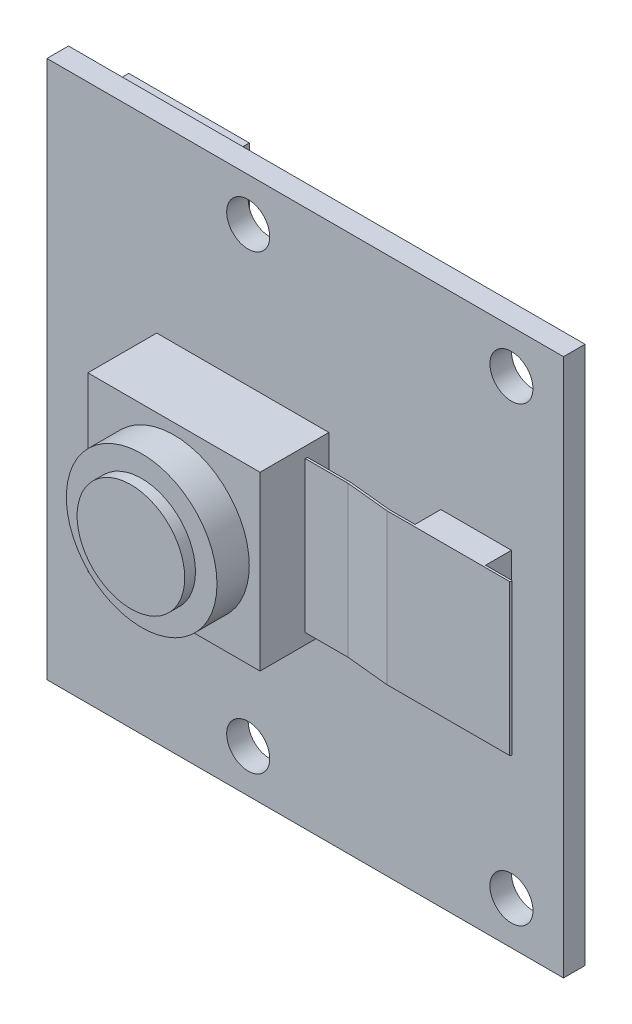
ISO-10303-21;
HEADER;
FILE_DESCRIPTION(('STEP AP214'),'2;1');
FILE_NAME('part.step','',(''),(''),'','','');
FILE_SCHEMA(('AUTOMOTIVE_DESIGN { 1 0 10303 214 1 1 1 1 }'));
ENDSEC;
DATA;
#1=APPLICATION_CONTEXT('core data for automotive mechanical design processes');
#2=APPLICATION_PROTOCOL_DEFINITION('international standard','automotive_design',2000,#1);
#3=PRODUCT_CONTEXT('',#1,'mechanical');
#4=PRODUCT('Part','Part','',(#3));
#5=PRODUCT_RELATED_PRODUCT_CATEGORY('part','',(#4));
#6=PRODUCT_DEFINITION_FORMATION('','',#4);
#7=PRODUCT_DEFINITION_CONTEXT('part definition',#1,'design');
#8=PRODUCT_DEFINITION('design','',#6,#7);
#9=PRODUCT_DEFINITION_SHAPE('','',#8);
#10=(LENGTH_UNIT() NAMED_UNIT(*) SI_UNIT(.MILLI.,.METRE.));
#11=(NAMED_UNIT(*) PLANE_ANGLE_UNIT() SI_UNIT($,.RADIAN.));
#12=(NAMED_UNIT(*) SI_UNIT($,.STERADIAN.) SOLID_ANGLE_UNIT());
#13=UNCERTAINTY_MEASURE_WITH_UNIT(LENGTH_MEASURE(1.E-05),#10,'distance_accuracy_value','');
#14=(GEOMETRIC_REPRESENTATION_CONTEXT(3) GLOBAL_UNCERTAINTY_ASSIGNED_CONTEXT((#13)) GLOBAL_UNIT_ASSIGNED_CONTEXT((#10,
#11,#12)) REPRESENTATION_CONTEXT('',''));
#15=CARTESIAN_POINT('',(0.,0.,0.));
#16=DIRECTION('',(0.,0.,1.));
#17=DIRECTION('',(1.,0.,0.));
#18=AXIS2_PLACEMENT_3D('',#15,#16,#17);
#19=CARTESIAN_POINT('',(0.,0.,0.));
#20=DIRECTION('',(0.,0.,1.));
#21=DIRECTION('',(1.,0.,0.));
#22=AXIS2_PLACEMENT_3D('',#19,#20,#21);
#23=PLANE('',#22);
#24=CARTESIAN_POINT('',(-2.65000000000001,10.5,0.));
#25=DIRECTION('',(0.,0.,1.));
#26=DIRECTION('',(-1.,0.,0.));
#27=AXIS2_PLACEMENT_3D('',#24,#25,#26);
#28=CIRCLE('',#27,1.);
#29=CARTESIAN_POINT('',(-3.65000000000001,10.5,0.));
#30=VERTEX_POINT('',#29);
#31=EDGE_CURVE('E410',#30,#30,#28,.T.);
#32=ORIENTED_EDGE('',*,*,#31,.T.);
#33=EDGE_LOOP('',(#32));
#34=FACE_BOUND('',#33,.T.);
#35=CARTESIAN_POINT('',(9.57999999999999,10.5,0.));
#36=DIRECTION('',(0.,0.,1.));
#37=DIRECTION('',(-1.,0.,0.));
#38=AXIS2_PLACEMENT_3D('',#35,#36,#37);
#39=CIRCLE('',#38,1.);
#40=CARTESIAN_POINT('',(8.57999999999999,10.5,0.));
#41=VERTEX_POINT('',#40);
#42=EDGE_CURVE('E415',#41,#41,#39,.T.);
#43=ORIENTED_EDGE('',*,*,#42,.T.);
#44=EDGE_LOOP('',(#43));
#45=FACE_BOUND('',#44,.T.);
#46=CARTESIAN_POINT('',(-2.65,-10.5,0.));
#47=DIRECTION('',(0.,0.,1.));
#48=DIRECTION('',(1.,0.,0.));
#49=AXIS2_PLACEMENT_3D('',#46,#47,#48);
#50=CIRCLE('',#49,1.);
#51=CARTESIAN_POINT('',(-1.65,-10.5,0.));
#52=VERTEX_POINT('',#51);
#53=EDGE_CURVE('E423',#52,#52,#50,.T.);
#54=ORIENTED_EDGE('',*,*,#53,.T.);
#55=EDGE_LOOP('',(#54));
#56=FACE_BOUND('',#55,.T.);
#57=CARTESIAN_POINT('',(9.57999999999999,-10.5,0.));
#58=DIRECTION('',(0.,0.,1.));
#59=DIRECTION('',(1.,0.,0.));
#60=AXIS2_PLACEMENT_3D('',#57,#58,#59);
#61=CIRCLE('',#60,1.);
#62=CARTESIAN_POINT('',(10.58,-10.5,0.));
#63=VERTEX_POINT('',#62);
#64=EDGE_CURVE('E431',#63,#63,#61,.T.);
#65=ORIENTED_EDGE('',*,*,#64,.T.);
#66=EDGE_LOOP('',(#65));
#67=FACE_BOUND('',#66,.T.);
#68=DIRECTION('',(1.,0.,0.));
#69=VECTOR('',#68,1.);
#70=CARTESIAN_POINT('',(-12.,9.99999999999999,0.));
#71=LINE('',#70,#69);
#72=CARTESIAN_POINT('',(-12.,9.99999999999998,0.));
#73=VERTEX_POINT('',#72);
#74=CARTESIAN_POINT('',(-6.40000000000001,9.99999999999998,0.));
#75=VERTEX_POINT('',#74);
#76=EDGE_CURVE('E222',#73,#75,#71,.T.);
#77=ORIENTED_EDGE('',*,*,#76,.F.);
#78=DIRECTION('',(0.,-1.,0.));
#79=VECTOR('',#78,1.);
#80=CARTESIAN_POINT('',(-12.,-12.5,0.));
#81=LINE('',#80,#79);
#82=CARTESIAN_POINT('',(-12.,12.5,0.));
#83=VERTEX_POINT('',#82);
#84=EDGE_CURVE('E458',#83,#73,#81,.T.);
#85=ORIENTED_EDGE('',*,*,#84,.F.);
#86=DIRECTION('',(-1.,0.,0.));
#87=VECTOR('',#86,1.);
#88=CARTESIAN_POINT('',(12.,12.5,0.));
#89=LINE('',#88,#87);
#90=CARTESIAN_POINT('',(12.,12.5,0.));
#91=VERTEX_POINT('',#90);
#92=EDGE_CURVE('E448',#91,#83,#89,.T.);
#93=ORIENTED_EDGE('',*,*,#92,.F.);
#94=DIRECTION('',(0.,1.,0.));
#95=VECTOR('',#94,1.);
#96=CARTESIAN_POINT('',(12.,-12.5,0.));
#97=LINE('',#96,#95);
#98=CARTESIAN_POINT('',(12.,-12.5,0.));
#99=VERTEX_POINT('',#98);
#100=EDGE_CURVE('E465',#99,#91,#97,.T.);
#101=ORIENTED_EDGE('',*,*,#100,.F.);
#102=DIRECTION('',(1.,0.,0.));
#103=VECTOR('',#102,1.);
#104=CARTESIAN_POINT('',(12.,-12.5,0.));
#105=LINE('',#104,#103);
#106=CARTESIAN_POINT('',(-12.,-12.5,0.));
#107=VERTEX_POINT('',#106);
#108=EDGE_CURVE('E462',#107,#99,#105,.T.);
#109=ORIENTED_EDGE('',*,*,#108,.F.);
#110=CARTESIAN_POINT('',(-12.,-10.,0.));
#111=VERTEX_POINT('',#110);
#112=EDGE_CURVE('E439',#111,#107,#81,.T.);
#113=ORIENTED_EDGE('',*,*,#112,.F.);
#114=DIRECTION('',(-1.,0.,0.));
#115=VECTOR('',#114,1.);
#116=CARTESIAN_POINT('',(-12.,-10.,0.));
#117=LINE('',#116,#115);
#118=CARTESIAN_POINT('',(-6.4,-10.,0.));
#119=VERTEX_POINT('',#118);
#120=EDGE_CURVE('E62',#119,#111,#117,.T.);
#121=ORIENTED_EDGE('',*,*,#120,.F.);
#122=DIRECTION('',(0.,-1.,0.));
#123=VECTOR('',#122,1.);
#124=CARTESIAN_POINT('',(-6.4,-10.,0.));
#125=LINE('',#124,#123);
#126=EDGE_CURVE('E57',#75,#119,#125,.T.);
#127=ORIENTED_EDGE('',*,*,#126,.F.);
#128=EDGE_LOOP('',(#77,#85,#93,#101,#109,#113,#121,#127));
#129=FACE_BOUND('',#128,.T.);
#130=ADVANCED_FACE('F41',(#34,#45,#56,#67,#129),#23,.F.);
#131=CARTESIAN_POINT('',(1.1,-4.,6.2));
#132=DIRECTION('',(-1.,0.,0.));
#133=DIRECTION('',(0.,0.,1.));
#134=AXIS2_PLACEMENT_3D('',#131,#132,#133);
#135=PLANE('',#134);
#136=DIRECTION('',(0.,1.,0.));
#137=VECTOR('',#136,1.);
#138=CARTESIAN_POINT('',(1.1,0.,4.2));
#139=LINE('',#138,#137);
#140=CARTESIAN_POINT('',(1.1,-4.,4.2));
#141=VERTEX_POINT('',#140);
#142=CARTESIAN_POINT('',(1.1,4.,4.2));
#143=VERTEX_POINT('',#142);
#144=EDGE_CURVE('E379',#141,#143,#139,.T.);
#145=ORIENTED_EDGE('',*,*,#144,.F.);
#146=DIRECTION('',(0.,0.,-1.));
#147=VECTOR('',#146,1.);
#148=CARTESIAN_POINT('',(1.1,-4.,6.2));
#149=LINE('',#148,#147);
#150=CARTESIAN_POINT('',(1.1,-4.,1.));
#151=VERTEX_POINT('',#150);
#152=EDGE_CURVE('E404',#141,#151,#149,.T.);
#153=ORIENTED_EDGE('',*,*,#152,.T.);
#154=DIRECTION('',(0.,1.,0.));
#155=VECTOR('',#154,1.);
#156=CARTESIAN_POINT('',(1.1,-4.,1.));
#157=LINE('',#156,#155);
#158=CARTESIAN_POINT('',(1.1,4.,1.));
#159=VERTEX_POINT('',#158);
#160=EDGE_CURVE('E390',#151,#159,#157,.T.);
#161=ORIENTED_EDGE('',*,*,#160,.T.);
#162=DIRECTION('',(0.,0.,-1.));
#163=VECTOR('',#162,1.);
#164=CARTESIAN_POINT('',(1.1,4.,6.2));
#165=LINE('',#164,#163);
#166=EDGE_CURVE('E401',#143,#159,#165,.T.);
#167=ORIENTED_EDGE('',*,*,#166,.F.);
#168=EDGE_LOOP('',(#145,#153,#161,#167));
#169=FACE_BOUND('',#168,.T.);
#170=DIRECTION('',(0.,0.,-1.));
#171=VECTOR('',#170,1.);
#172=CARTESIAN_POINT('',(1.1,-3.5,0.));
#173=LINE('',#172,#171);
#174=CARTESIAN_POINT('',(1.1,-3.5,2.1));
#175=VERTEX_POINT('',#174);
#176=CARTESIAN_POINT('',(1.1,-3.5,2.));
#177=VERTEX_POINT('',#176);
#178=EDGE_CURVE('E294',#175,#177,#173,.T.);
#179=ORIENTED_EDGE('',*,*,#178,.F.);
#180=DIRECTION('',(0.,1.,0.));
#181=VECTOR('',#180,1.);
#182=CARTESIAN_POINT('',(1.1,-3.5,2.1));
#183=LINE('',#182,#181);
#184=CARTESIAN_POINT('',(1.1,3.5,2.1));
#185=VERTEX_POINT('',#184);
#186=EDGE_CURVE('E336',#175,#185,#183,.T.);
#187=ORIENTED_EDGE('',*,*,#186,.T.);
#188=DIRECTION('',(0.,0.,-1.));
#189=VECTOR('',#188,1.);
#190=CARTESIAN_POINT('',(1.1,3.5,0.));
#191=LINE('',#190,#189);
#192=CARTESIAN_POINT('',(1.1,3.5,2.));
#193=VERTEX_POINT('',#192);
#194=EDGE_CURVE('E253',#185,#193,#191,.T.);
#195=ORIENTED_EDGE('',*,*,#194,.T.);
#196=DIRECTION('',(0.,1.,0.));
#197=VECTOR('',#196,1.);
#198=CARTESIAN_POINT('',(1.1,-3.5,2.));
#199=LINE('',#198,#197);
#200=EDGE_CURVE('E340',#177,#193,#199,.T.);
#201=ORIENTED_EDGE('',*,*,#200,.F.);
#202=EDGE_LOOP('',(#179,#187,#195,#201));
#203=FACE_BOUND('',#202,.T.);
#204=ADVANCED_FACE('F509',(#169,#203),#135,.F.);
#205=CARTESIAN_POINT('',(0.,0.,1.));
#206=DIRECTION('',(0.,0.,1.));
#207=DIRECTION('',(1.,0.,0.));
#208=AXIS2_PLACEMENT_3D('',#205,#206,#207);
#209=PLANE('',#208);
#210=CARTESIAN_POINT('',(9.57999999999999,10.5,1.));
#211=DIRECTION('',(0.,0.,1.));
#212=DIRECTION('',(-1.,0.,0.));
#213=AXIS2_PLACEMENT_3D('',#210,#211,#212);
#214=CIRCLE('',#213,1.);
#215=CARTESIAN_POINT('',(8.57999999999999,10.5,1.));
#216=VERTEX_POINT('',#215);
#217=EDGE_CURVE('E419',#216,#216,#214,.T.);
#218=ORIENTED_EDGE('',*,*,#217,.F.);
#219=EDGE_LOOP('',(#218));
#220=FACE_BOUND('',#219,.T.);
#221=CARTESIAN_POINT('',(9.57999999999999,-10.5,1.));
#222=DIRECTION('',(0.,0.,1.));
#223=DIRECTION('',(1.,0.,0.));
#224=AXIS2_PLACEMENT_3D('',#221,#222,#223);
#225=CIRCLE('',#224,1.);
#226=CARTESIAN_POINT('',(10.58,-10.5,1.));
#227=VERTEX_POINT('',#226);
#228=EDGE_CURVE('E435',#227,#227,#225,.T.);
#229=ORIENTED_EDGE('',*,*,#228,.F.);
#230=EDGE_LOOP('',(#229));
#231=FACE_BOUND('',#230,.T.);
#232=DIRECTION('',(0.,-1.,0.));
#233=VECTOR('',#232,1.);
#234=CARTESIAN_POINT('',(-12.,-12.5,1.));
#235=LINE('',#234,#233);
#236=CARTESIAN_POINT('',(-12.,12.5,1.));
#237=VERTEX_POINT('',#236);
#238=CARTESIAN_POINT('',(-12.,-12.5,1.));
#239=VERTEX_POINT('',#238);
#240=EDGE_CURVE('E443',#237,#239,#235,.T.);
#241=ORIENTED_EDGE('',*,*,#240,.T.);
#242=DIRECTION('',(1.,0.,0.));
#243=VECTOR('',#242,1.);
#244=CARTESIAN_POINT('',(12.,-12.5,1.));
#245=LINE('',#244,#243);
#246=CARTESIAN_POINT('',(12.,-12.5,1.));
#247=VERTEX_POINT('',#246);
#248=EDGE_CURVE('E447',#239,#247,#245,.T.);
#249=ORIENTED_EDGE('',*,*,#248,.T.);
#250=DIRECTION('',(0.,1.,0.));
#251=VECTOR('',#250,1.);
#252=CARTESIAN_POINT('',(12.,-12.5,1.));
#253=LINE('',#252,#251);
#254=CARTESIAN_POINT('',(12.,12.5,1.));
#255=VERTEX_POINT('',#254);
#256=EDGE_CURVE('E451',#247,#255,#253,.T.);
#257=ORIENTED_EDGE('',*,*,#256,.T.);
#258=DIRECTION('',(-1.,0.,0.));
#259=VECTOR('',#258,1.);
#260=CARTESIAN_POINT('',(12.,12.5,1.));
#261=LINE('',#260,#259);
#262=EDGE_CURVE('E454',#255,#237,#261,.T.);
#263=ORIENTED_EDGE('',*,*,#262,.T.);
#264=EDGE_LOOP('',(#241,#249,#257,#263));
#265=FACE_BOUND('',#264,.T.);
#266=CARTESIAN_POINT('',(-2.65,-10.5,1.));
#267=DIRECTION('',(0.,0.,1.));
#268=DIRECTION('',(1.,0.,0.));
#269=AXIS2_PLACEMENT_3D('',#266,#267,#268);
#270=CIRCLE('',#269,1.);
#271=CARTESIAN_POINT('',(-1.65,-10.5,1.));
#272=VERTEX_POINT('',#271);
#273=EDGE_CURVE('E427',#272,#272,#270,.T.);
#274=ORIENTED_EDGE('',*,*,#273,.F.);
#275=EDGE_LOOP('',(#274));
#276=FACE_BOUND('',#275,.T.);
#277=CARTESIAN_POINT('',(-2.65000000000001,10.5,1.));
#278=DIRECTION('',(0.,0.,1.));
#279=DIRECTION('',(-1.,0.,0.));
#280=AXIS2_PLACEMENT_3D('',#277,#278,#279);
#281=CIRCLE('',#280,1.);
#282=CARTESIAN_POINT('',(-3.65000000000001,10.5,1.));
#283=VERTEX_POINT('',#282);
#284=EDGE_CURVE('E411',#283,#283,#281,.T.);
#285=ORIENTED_EDGE('',*,*,#284,.F.);
#286=EDGE_LOOP('',(#285));
#287=FACE_BOUND('',#286,.T.);
#288=DIRECTION('',(1.,0.,0.));
#289=VECTOR('',#288,1.);
#290=CARTESIAN_POINT('',(1.1,-4.,1.));
#291=LINE('',#290,#289);
#292=CARTESIAN_POINT('',(-6.9,-4.,1.));
#293=VERTEX_POINT('',#292);
#294=EDGE_CURVE('E386',#293,#151,#291,.T.);
#295=ORIENTED_EDGE('',*,*,#294,.F.);
#296=DIRECTION('',(0.,-1.,0.));
#297=VECTOR('',#296,1.);
#298=CARTESIAN_POINT('',(-6.9,-4.,1.));
#299=LINE('',#298,#297);
#300=CARTESIAN_POINT('',(-6.9,4.,1.));
#301=VERTEX_POINT('',#300);
#302=EDGE_CURVE('E382',#301,#293,#299,.T.);
#303=ORIENTED_EDGE('',*,*,#302,.F.);
#304=DIRECTION('',(-1.,0.,0.));
#305=VECTOR('',#304,1.);
#306=CARTESIAN_POINT('',(1.1,4.,1.));
#307=LINE('',#306,#305);
#308=EDGE_CURVE('E394',#159,#301,#307,.T.);
#309=ORIENTED_EDGE('',*,*,#308,.F.);
#310=ORIENTED_EDGE('',*,*,#160,.F.);
#311=EDGE_LOOP('',(#295,#303,#309,#310));
#312=FACE_BOUND('',#311,.T.);
#313=DIRECTION('',(0.,1.,0.));
#314=VECTOR('',#313,1.);
#315=CARTESIAN_POINT('',(9.57999999999999,-3.5,1.));
#316=LINE('',#315,#314);
#317=CARTESIAN_POINT('',(9.57999999999999,-3.5,1.));
#318=VERTEX_POINT('',#317);
#319=CARTESIAN_POINT('',(9.57999999999999,3.5,1.));
#320=VERTEX_POINT('',#319);
#321=EDGE_CURVE('E316',#318,#320,#316,.T.);
#322=ORIENTED_EDGE('',*,*,#321,.F.);
#323=DIRECTION('',(-1.,0.,0.));
#324=VECTOR('',#323,1.);
#325=CARTESIAN_POINT('',(0.,-3.5,1.));
#326=LINE('',#325,#324);
#327=CARTESIAN_POINT('',(6.3,-3.5,1.));
#328=VERTEX_POINT('',#327);
#329=EDGE_CURVE('E277',#318,#328,#326,.T.);
#330=ORIENTED_EDGE('',*,*,#329,.T.);
#331=DIRECTION('',(0.,1.,0.));
#332=VECTOR('',#331,1.);
#333=CARTESIAN_POINT('',(6.3,-3.5,1.));
#334=LINE('',#333,#332);
#335=CARTESIAN_POINT('',(6.3,3.5,1.));
#336=VERTEX_POINT('',#335);
#337=EDGE_CURVE('E315',#328,#336,#334,.T.);
#338=ORIENTED_EDGE('',*,*,#337,.T.);
#339=DIRECTION('',(-1.,0.,0.));
#340=VECTOR('',#339,1.);
#341=CARTESIAN_POINT('',(0.,3.5,1.));
#342=LINE('',#341,#340);
#343=EDGE_CURVE('E226',#320,#336,#342,.T.);
#344=ORIENTED_EDGE('',*,*,#343,.F.);
#345=EDGE_LOOP('',(#322,#330,#338,#344));
#346=FACE_BOUND('',#345,.T.);
#347=ADVANCED_FACE('F498',(#220,#231,#265,#276,#287,#312,#346),#209,.T.);
#348=CARTESIAN_POINT('',(-2.9,0.,4.2));
#349=DIRECTION('',(0.,0.,1.));
#350=DIRECTION('',(1.,0.,0.));
#351=AXIS2_PLACEMENT_3D('',#348,#349,#350);
#352=CYLINDRICAL_SURFACE('',#351,3.5);
#353=CARTESIAN_POINT('',(-2.9,0.,4.2));
#354=DIRECTION('',(0.,0.,1.));
#355=DIRECTION('',(1.,0.,0.));
#356=AXIS2_PLACEMENT_3D('',#353,#354,#355);
#357=CIRCLE('',#356,3.5);
#358=CARTESIAN_POINT('',(0.599999999999997,0.,4.2));
#359=VERTEX_POINT('',#358);
#360=EDGE_CURVE('E366',#359,#359,#357,.T.);
#361=ORIENTED_EDGE('',*,*,#360,.T.);
#362=EDGE_LOOP('',(#361));
#363=FACE_BOUND('',#362,.T.);
#364=CARTESIAN_POINT('',(-2.9,0.,5.7));
#365=DIRECTION('',(0.,0.,1.));
#366=DIRECTION('',(1.,0.,0.));
#367=AXIS2_PLACEMENT_3D('',#364,#365,#366);
#368=CIRCLE('',#367,3.5);
#369=CARTESIAN_POINT('',(0.599999999999997,0.,5.7));
#370=VERTEX_POINT('',#369);
#371=EDGE_CURVE('E359',#370,#370,#368,.T.);
#372=ORIENTED_EDGE('',*,*,#371,.F.);
#373=EDGE_LOOP('',(#372));
#374=FACE_BOUND('',#373,.T.);
#375=ADVANCED_FACE('F548',(#363,#374),#352,.T.);
#376=CARTESIAN_POINT('',(-6.9,-4.,6.2));
#377=DIRECTION('',(1.,0.,0.));
#378=DIRECTION('',(0.,0.,-1.));
#379=AXIS2_PLACEMENT_3D('',#376,#377,#378);
#380=PLANE('',#379);
#381=DIRECTION('',(0.,-1.,0.));
#382=VECTOR('',#381,1.);
#383=CARTESIAN_POINT('',(-6.9,0.,4.2));
#384=LINE('',#383,#382);
#385=CARTESIAN_POINT('',(-6.9,4.,4.2));
#386=VERTEX_POINT('',#385);
#387=CARTESIAN_POINT('',(-6.9,-4.,4.2));
#388=VERTEX_POINT('',#387);
#389=EDGE_CURVE('E373',#386,#388,#384,.T.);
#390=ORIENTED_EDGE('',*,*,#389,.F.);
#391=DIRECTION('',(0.,0.,-1.));
#392=VECTOR('',#391,1.);
#393=CARTESIAN_POINT('',(-6.9,4.,6.2));
#394=LINE('',#393,#392);
#395=EDGE_CURVE('E398',#386,#301,#394,.T.);
#396=ORIENTED_EDGE('',*,*,#395,.T.);
#397=ORIENTED_EDGE('',*,*,#302,.T.);
#398=DIRECTION('',(0.,0.,-1.));
#399=VECTOR('',#398,1.);
#400=CARTESIAN_POINT('',(-6.9,-4.,6.2));
#401=LINE('',#400,#399);
#402=EDGE_CURVE('E407',#388,#293,#401,.T.);
#403=ORIENTED_EDGE('',*,*,#402,.F.);
#404=EDGE_LOOP('',(#390,#396,#397,#403));
#405=FACE_BOUND('',#404,.T.);
#406=ADVANCED_FACE('F544',(#405),#380,.F.);
#407=CARTESIAN_POINT('',(1.1,-4.,6.2));
#408=DIRECTION('',(0.,1.,0.));
#409=DIRECTION('',(-1.,0.,0.));
#410=AXIS2_PLACEMENT_3D('',#407,#408,#409);
#411=PLANE('',#410);
#412=DIRECTION('',(1.,0.,0.));
#413=VECTOR('',#412,1.);
#414=CARTESIAN_POINT('',(0.,-4.,4.2));
#415=LINE('',#414,#413);
#416=EDGE_CURVE('E376',#388,#141,#415,.T.);
#417=ORIENTED_EDGE('',*,*,#416,.F.);
#418=ORIENTED_EDGE('',*,*,#402,.T.);
#419=ORIENTED_EDGE('',*,*,#294,.T.);
#420=ORIENTED_EDGE('',*,*,#152,.F.);
#421=EDGE_LOOP('',(#417,#418,#419,#420));
#422=FACE_BOUND('',#421,.T.);
#423=ADVANCED_FACE('F547',(#422),#411,.F.);
#424=CARTESIAN_POINT('',(1.1,4.,6.2));
#425=DIRECTION('',(0.,-1.,0.));
#426=DIRECTION('',(1.,0.,0.));
#427=AXIS2_PLACEMENT_3D('',#424,#425,#426);
#428=PLANE('',#427);
#429=DIRECTION('',(-1.,0.,0.));
#430=VECTOR('',#429,1.);
#431=CARTESIAN_POINT('',(0.,4.,4.2));
#432=LINE('',#431,#430);
#433=EDGE_CURVE('E370',#143,#386,#432,.T.);
#434=ORIENTED_EDGE('',*,*,#433,.F.);
#435=ORIENTED_EDGE('',*,*,#166,.T.);
#436=ORIENTED_EDGE('',*,*,#308,.T.);
#437=ORIENTED_EDGE('',*,*,#395,.F.);
#438=EDGE_LOOP('',(#434,#435,#436,#437));
#439=FACE_BOUND('',#438,.T.);
#440=ADVANCED_FACE('F507',(#439),#428,.F.);
#441=CARTESIAN_POINT('',(-12.,-12.5,1.));
#442=DIRECTION('',(1.,0.,0.));
#443=DIRECTION('',(0.,0.,-1.));
#444=AXIS2_PLACEMENT_3D('',#441,#442,#443);
#445=PLANE('',#444);
#446=ORIENTED_EDGE('',*,*,#84,.T.);
#447=DIRECTION('',(0.,0.,1.));
#448=VECTOR('',#447,1.);
#449=CARTESIAN_POINT('',(-12.,9.99999999999999,-2.8));
#450=LINE('',#449,#448);
#451=CARTESIAN_POINT('',(-12.,9.99999999999999,-2.8));
#452=VERTEX_POINT('',#451);
#453=EDGE_CURVE('E233',#452,#73,#450,.T.);
#454=ORIENTED_EDGE('',*,*,#453,.F.);
#455=DIRECTION('',(0.,1.,0.));
#456=VECTOR('',#455,1.);
#457=CARTESIAN_POINT('',(-12.,-10.,-2.8));
#458=LINE('',#457,#456);
#459=CARTESIAN_POINT('',(-12.,-10.,-2.8));
#460=VERTEX_POINT('',#459);
#461=EDGE_CURVE('E211',#460,#452,#458,.T.);
#462=ORIENTED_EDGE('',*,*,#461,.F.);
#463=DIRECTION('',(0.,0.,1.));
#464=VECTOR('',#463,1.);
#465=CARTESIAN_POINT('',(-12.,-10.,-2.8));
#466=LINE('',#465,#464);
#467=EDGE_CURVE('E207',#460,#111,#466,.T.);
#468=ORIENTED_EDGE('',*,*,#467,.T.);
#469=ORIENTED_EDGE('',*,*,#112,.T.);
#470=DIRECTION('',(0.,0.,-1.));
#471=VECTOR('',#470,1.);
#472=CARTESIAN_POINT('',(-12.,-12.5,1.));
#473=LINE('',#472,#471);
#474=EDGE_CURVE('E11',#239,#107,#473,.T.);
#475=ORIENTED_EDGE('',*,*,#474,.F.);
#476=ORIENTED_EDGE('',*,*,#240,.F.);
#477=DIRECTION('',(0.,0.,-1.));
#478=VECTOR('',#477,1.);
#479=CARTESIAN_POINT('',(-12.,12.5,1.));
#480=LINE('',#479,#478);
#481=EDGE_CURVE('E457',#237,#83,#480,.T.);
#482=ORIENTED_EDGE('',*,*,#481,.T.);
#483=EDGE_LOOP('',(#446,#454,#462,#468,#469,#475,#476,#482));
#484=FACE_BOUND('',#483,.T.);
#485=ADVANCED_FACE('F43',(#484),#445,.F.);
#486=CARTESIAN_POINT('',(12.,-12.5,1.));
#487=DIRECTION('',(0.,1.,0.));
#488=DIRECTION('',(-1.,0.,0.));
#489=AXIS2_PLACEMENT_3D('',#486,#487,#488);
#490=PLANE('',#489);
#491=ORIENTED_EDGE('',*,*,#108,.T.);
#492=DIRECTION('',(0.,0.,-1.));
#493=VECTOR('',#492,1.);
#494=CARTESIAN_POINT('',(12.,-12.5,1.));
#495=LINE('',#494,#493);
#496=EDGE_CURVE('E50',#247,#99,#495,.T.);
#497=ORIENTED_EDGE('',*,*,#496,.F.);
#498=ORIENTED_EDGE('',*,*,#248,.F.);
#499=ORIENTED_EDGE('',*,*,#474,.T.);
#500=EDGE_LOOP('',(#491,#497,#498,#499));
#501=FACE_BOUND('',#500,.T.);
#502=ADVANCED_FACE('F500',(#501),#490,.F.);
#503=CARTESIAN_POINT('',(12.,-12.5,1.));
#504=DIRECTION('',(-1.,0.,0.));
#505=DIRECTION('',(0.,0.,1.));
#506=AXIS2_PLACEMENT_3D('',#503,#504,#505);
#507=PLANE('',#506);
#508=ORIENTED_EDGE('',*,*,#100,.T.);
#509=DIRECTION('',(0.,0.,-1.));
#510=VECTOR('',#509,1.);
#511=CARTESIAN_POINT('',(12.,12.5,1.));
#512=LINE('',#511,#510);
#513=EDGE_CURVE('E473',#255,#91,#512,.T.);
#514=ORIENTED_EDGE('',*,*,#513,.F.);
#515=ORIENTED_EDGE('',*,*,#256,.F.);
#516=ORIENTED_EDGE('',*,*,#496,.T.);
#517=EDGE_LOOP('',(#508,#514,#515,#516));
#518=FACE_BOUND('',#517,.T.);
#519=ADVANCED_FACE('F482',(#518),#507,.F.);
#520=CARTESIAN_POINT('',(12.,12.5,1.));
#521=DIRECTION('',(0.,-1.,0.));
#522=DIRECTION('',(1.,0.,0.));
#523=AXIS2_PLACEMENT_3D('',#520,#521,#522);
#524=PLANE('',#523);
#525=ORIENTED_EDGE('',*,*,#92,.T.);
#526=ORIENTED_EDGE('',*,*,#481,.F.);
#527=ORIENTED_EDGE('',*,*,#262,.F.);
#528=ORIENTED_EDGE('',*,*,#513,.T.);
#529=EDGE_LOOP('',(#525,#526,#527,#528));
#530=FACE_BOUND('',#529,.T.);
#531=ADVANCED_FACE('F490',(#530),#524,.F.);
#532=CARTESIAN_POINT('',(9.57999999999999,-10.5,1.));
#533=DIRECTION('',(0.,0.,-1.));
#534=DIRECTION('',(-1.,0.,0.));
#535=AXIS2_PLACEMENT_3D('',#532,#533,#534);
#536=CYLINDRICAL_SURFACE('',#535,1.);
#537=ORIENTED_EDGE('',*,*,#228,.T.);
#538=EDGE_LOOP('',(#537));
#539=FACE_BOUND('',#538,.T.);
#540=ORIENTED_EDGE('',*,*,#64,.F.);
#541=EDGE_LOOP('',(#540));
#542=FACE_BOUND('',#541,.T.);
#543=ADVANCED_FACE('F522',(#539,#542),#536,.F.);
#544=CARTESIAN_POINT('',(-2.65,-10.5,1.));
#545=DIRECTION('',(0.,0.,-1.));
#546=DIRECTION('',(-1.,0.,0.));
#547=AXIS2_PLACEMENT_3D('',#544,#545,#546);
#548=CYLINDRICAL_SURFACE('',#547,1.);
#549=ORIENTED_EDGE('',*,*,#273,.T.);
#550=EDGE_LOOP('',(#549));
#551=FACE_BOUND('',#550,.T.);
#552=ORIENTED_EDGE('',*,*,#53,.F.);
#553=EDGE_LOOP('',(#552));
#554=FACE_BOUND('',#553,.T.);
#555=ADVANCED_FACE('F526',(#551,#554),#548,.F.);
#556=CARTESIAN_POINT('',(9.57999999999999,10.5,1.));
#557=DIRECTION('',(0.,0.,-1.));
#558=DIRECTION('',(-1.,0.,0.));
#559=AXIS2_PLACEMENT_3D('',#556,#557,#558);
#560=CYLINDRICAL_SURFACE('',#559,1.);
#561=ORIENTED_EDGE('',*,*,#217,.T.);
#562=EDGE_LOOP('',(#561));
#563=FACE_BOUND('',#562,.T.);
#564=ORIENTED_EDGE('',*,*,#42,.F.);
#565=EDGE_LOOP('',(#564));
#566=FACE_BOUND('',#565,.T.);
#567=ADVANCED_FACE('F531',(#563,#566),#560,.F.);
#568=CARTESIAN_POINT('',(-2.65000000000001,10.5,1.));
#569=DIRECTION('',(0.,0.,-1.));
#570=DIRECTION('',(-1.,0.,0.));
#571=AXIS2_PLACEMENT_3D('',#568,#569,#570);
#572=CYLINDRICAL_SURFACE('',#571,1.);
#573=ORIENTED_EDGE('',*,*,#284,.T.);
#574=EDGE_LOOP('',(#573));
#575=FACE_BOUND('',#574,.T.);
#576=ORIENTED_EDGE('',*,*,#31,.F.);
#577=EDGE_LOOP('',(#576));
#578=FACE_BOUND('',#577,.T.);
#579=ADVANCED_FACE('F538',(#575,#578),#572,.F.);
#580=CARTESIAN_POINT('',(0.,0.,4.2));
#581=DIRECTION('',(0.,0.,1.));
#582=DIRECTION('',(1.,0.,0.));
#583=AXIS2_PLACEMENT_3D('',#580,#581,#582);
#584=PLANE('',#583);
#585=ORIENTED_EDGE('',*,*,#360,.F.);
#586=EDGE_LOOP('',(#585));
#587=FACE_BOUND('',#586,.T.);
#588=ORIENTED_EDGE('',*,*,#433,.T.);
#589=ORIENTED_EDGE('',*,*,#389,.T.);
#590=ORIENTED_EDGE('',*,*,#416,.T.);
#591=ORIENTED_EDGE('',*,*,#144,.T.);
#592=EDGE_LOOP('',(#588,#589,#590,#591));
#593=FACE_BOUND('',#592,.T.);
#594=ADVANCED_FACE('F542',(#587,#593),#584,.T.);
#595=CARTESIAN_POINT('',(-2.9,0.,5.7));
#596=DIRECTION('',(0.,0.,1.));
#597=DIRECTION('',(1.,0.,0.));
#598=AXIS2_PLACEMENT_3D('',#595,#596,#597);
#599=PLANE('',#598);
#600=CARTESIAN_POINT('',(-2.9,0.,5.7));
#601=DIRECTION('',(0.,0.,1.));
#602=DIRECTION('',(1.,0.,0.));
#603=AXIS2_PLACEMENT_3D('',#600,#601,#602);
#604=CIRCLE('',#603,2.5);
#605=CARTESIAN_POINT('',(-0.400000000000003,0.,5.7));
#606=VERTEX_POINT('',#605);
#607=EDGE_CURVE('E355',#606,#606,#604,.T.);
#608=ORIENTED_EDGE('',*,*,#607,.F.);
#609=EDGE_LOOP('',(#608));
#610=FACE_BOUND('',#609,.T.);
#611=ORIENTED_EDGE('',*,*,#371,.T.);
#612=EDGE_LOOP('',(#611));
#613=FACE_BOUND('',#612,.T.);
#614=ADVANCED_FACE('F567',(#610,#613),#599,.T.);
#615=CARTESIAN_POINT('',(-2.9,0.,5.7));
#616=DIRECTION('',(0.,0.,1.));
#617=DIRECTION('',(1.,0.,0.));
#618=AXIS2_PLACEMENT_3D('',#615,#616,#617);
#619=CYLINDRICAL_SURFACE('',#618,2.5);
#620=ORIENTED_EDGE('',*,*,#607,.T.);
#621=EDGE_LOOP('',(#620));
#622=FACE_BOUND('',#621,.T.);
#623=CARTESIAN_POINT('',(-2.9,0.,6.2));
#624=DIRECTION('',(0.,0.,1.));
#625=DIRECTION('',(1.,0.,0.));
#626=AXIS2_PLACEMENT_3D('',#623,#624,#625);
#627=CIRCLE('',#626,2.5);
#628=CARTESIAN_POINT('',(-0.400000000000003,0.,6.2));
#629=VERTEX_POINT('',#628);
#630=EDGE_CURVE('E320',#629,#629,#627,.T.);
#631=ORIENTED_EDGE('',*,*,#630,.F.);
#632=EDGE_LOOP('',(#631));
#633=FACE_BOUND('',#632,.T.);
#634=ADVANCED_FACE('F560',(#622,#633),#619,.T.);
#635=CARTESIAN_POINT('',(0.,0.,6.2));
#636=DIRECTION('',(0.,0.,1.));
#637=DIRECTION('',(1.,0.,0.));
#638=AXIS2_PLACEMENT_3D('',#635,#636,#637);
#639=PLANE('',#638);
#640=ORIENTED_EDGE('',*,*,#630,.T.);
#641=EDGE_LOOP('',(#640));
#642=FACE_BOUND('',#641,.T.);
#643=ADVANCED_FACE('F556',(#642),#639,.T.);
#644=CARTESIAN_POINT('',(9.57999999999999,-3.5,0.));
#645=DIRECTION('',(-1.,0.,0.));
#646=DIRECTION('',(0.,0.,1.));
#647=AXIS2_PLACEMENT_3D('',#644,#645,#646);
#648=PLANE('',#647);
#649=ORIENTED_EDGE('',*,*,#321,.T.);
#650=DIRECTION('',(0.,0.,1.));
#651=VECTOR('',#650,1.);
#652=CARTESIAN_POINT('',(9.57999999999999,3.5,0.));
#653=LINE('',#652,#651);
#654=CARTESIAN_POINT('',(9.57999999999999,3.5,2.2));
#655=VERTEX_POINT('',#654);
#656=EDGE_CURVE('E273',#320,#655,#653,.T.);
#657=ORIENTED_EDGE('',*,*,#656,.T.);
#658=DIRECTION('',(0.,1.,0.));
#659=VECTOR('',#658,1.);
#660=CARTESIAN_POINT('',(9.57999999999999,-3.5,2.2));
#661=LINE('',#660,#659);
#662=CARTESIAN_POINT('',(9.57999999999999,-3.5,2.2));
#663=VERTEX_POINT('',#662);
#664=EDGE_CURVE('E321',#663,#655,#661,.T.);
#665=ORIENTED_EDGE('',*,*,#664,.F.);
#666=DIRECTION('',(0.,0.,1.));
#667=VECTOR('',#666,1.);
#668=CARTESIAN_POINT('',(9.57999999999999,-3.5,0.));
#669=LINE('',#668,#667);
#670=EDGE_CURVE('E312',#318,#663,#669,.T.);
#671=ORIENTED_EDGE('',*,*,#670,.F.);
#672=EDGE_LOOP('',(#649,#657,#665,#671));
#673=FACE_BOUND('',#672,.T.);
#674=ADVANCED_FACE('F559',(#673),#648,.F.);
#675=CARTESIAN_POINT('',(0.,-3.5,2.2));
#676=DIRECTION('',(0.,0.,1.));
#677=DIRECTION('',(1.,0.,0.));
#678=AXIS2_PLACEMENT_3D('',#675,#676,#677);
#679=PLANE('',#678);
#680=ORIENTED_EDGE('',*,*,#664,.T.);
#681=DIRECTION('',(1.,0.,0.));
#682=VECTOR('',#681,1.);
#683=CARTESIAN_POINT('',(0.,3.5,2.2));
#684=LINE('',#683,#682);
#685=CARTESIAN_POINT('',(10.78,3.5,2.2));
#686=VERTEX_POINT('',#685);
#687=EDGE_CURVE('E245',#655,#686,#684,.T.);
#688=ORIENTED_EDGE('',*,*,#687,.T.);
#689=DIRECTION('',(0.,1.,0.));
#690=VECTOR('',#689,1.);
#691=CARTESIAN_POINT('',(10.78,-3.5,2.2));
#692=LINE('',#691,#690);
#693=CARTESIAN_POINT('',(10.78,-3.5,2.2));
#694=VERTEX_POINT('',#693);
#695=EDGE_CURVE('E324',#694,#686,#692,.T.);
#696=ORIENTED_EDGE('',*,*,#695,.F.);
#697=DIRECTION('',(1.,0.,0.));
#698=VECTOR('',#697,1.);
#699=CARTESIAN_POINT('',(0.,-3.5,2.2));
#700=LINE('',#699,#698);
#701=EDGE_CURVE('E288',#663,#694,#700,.T.);
#702=ORIENTED_EDGE('',*,*,#701,.F.);
#703=EDGE_LOOP('',(#680,#688,#696,#702));
#704=FACE_BOUND('',#703,.T.);
#705=ADVANCED_FACE('F604',(#704),#679,.F.);
#706=CARTESIAN_POINT('',(10.78,-3.5,2.25));
#707=DIRECTION('',(0.,1.,0.));
#708=DIRECTION('',(0.,0.,1.));
#709=AXIS2_PLACEMENT_3D('',#706,#707,#708);
#710=CYLINDRICAL_SURFACE('',#709,0.0499999999999986);
#711=ORIENTED_EDGE('',*,*,#695,.T.);
#712=CARTESIAN_POINT('',(10.78,3.5,2.25));
#713=DIRECTION('',(0.,1.,0.));
#714=DIRECTION('',(0.,0.,1.));
#715=AXIS2_PLACEMENT_3D('',#712,#713,#714);
#716=CIRCLE('',#715,0.0499999999999986);
#717=CARTESIAN_POINT('',(10.78,3.5,2.3));
#718=VERTEX_POINT('',#717);
#719=EDGE_CURVE('E269',#686,#718,#716,.F.);
#720=ORIENTED_EDGE('',*,*,#719,.T.);
#721=DIRECTION('',(0.,1.,0.));
#722=VECTOR('',#721,1.);
#723=CARTESIAN_POINT('',(10.78,-3.5,2.3));
#724=LINE('',#723,#722);
#725=CARTESIAN_POINT('',(10.78,-3.5,2.3));
#726=VERTEX_POINT('',#725);
#727=EDGE_CURVE('E327',#726,#718,#724,.T.);
#728=ORIENTED_EDGE('',*,*,#727,.F.);
#729=CARTESIAN_POINT('',(10.78,-3.5,2.25));
#730=DIRECTION('',(0.,1.,0.));
#731=DIRECTION('',(0.,0.,1.));
#732=AXIS2_PLACEMENT_3D('',#729,#730,#731);
#733=CIRCLE('',#732,0.0499999999999986);
#734=EDGE_CURVE('E309',#694,#726,#733,.F.);
#735=ORIENTED_EDGE('',*,*,#734,.F.);
#736=EDGE_LOOP('',(#711,#720,#728,#735));
#737=FACE_BOUND('',#736,.T.);
#738=ADVANCED_FACE('F600',(#737),#710,.T.);
#739=CARTESIAN_POINT('',(0.,-3.5,2.3));
#740=DIRECTION('',(0.,0.,1.));
#741=DIRECTION('',(1.,0.,0.));
#742=AXIS2_PLACEMENT_3D('',#739,#740,#741);
#743=PLANE('',#742);
#744=ORIENTED_EDGE('',*,*,#727,.T.);
#745=DIRECTION('',(1.,0.,0.));
#746=VECTOR('',#745,1.);
#747=CARTESIAN_POINT('',(0.,3.5,2.3));
#748=LINE('',#747,#746);
#749=CARTESIAN_POINT('',(5.09501243788791,3.5,2.3));
#750=VERTEX_POINT('',#749);
#751=EDGE_CURVE('E265',#750,#718,#748,.T.);
#752=ORIENTED_EDGE('',*,*,#751,.F.);
#753=DIRECTION('',(0.,1.,0.));
#754=VECTOR('',#753,1.);
#755=CARTESIAN_POINT('',(5.09501243788791,-3.5,2.3));
#756=LINE('',#755,#754);
#757=CARTESIAN_POINT('',(5.09501243788791,-3.5,2.3));
#758=VERTEX_POINT('',#757);
#759=EDGE_CURVE('E330',#758,#750,#756,.T.);
#760=ORIENTED_EDGE('',*,*,#759,.F.);
#761=DIRECTION('',(1.,0.,0.));
#762=VECTOR('',#761,1.);
#763=CARTESIAN_POINT('',(0.,-3.5,2.3));
#764=LINE('',#763,#762);
#765=EDGE_CURVE('E305',#758,#726,#764,.T.);
#766=ORIENTED_EDGE('',*,*,#765,.T.);
#767=EDGE_LOOP('',(#744,#752,#760,#766));
#768=FACE_BOUND('',#767,.T.);
#769=ADVANCED_FACE('F596',(#768),#743,.T.);
#770=CARTESIAN_POINT('',(-0.177277104575367,-3.5,1.77277104575367));
#771=DIRECTION('',(-0.099503719020999,0.,0.995037190209989));
#772=DIRECTION('',(0.995037190209989,0.,0.099503719020999));
#773=AXIS2_PLACEMENT_3D('',#770,#771,#772);
#774=PLANE('',#773);
#775=ORIENTED_EDGE('',*,*,#759,.T.);
#776=DIRECTION('',(0.995037190209989,0.,0.099503719020999));
#777=VECTOR('',#776,1.);
#778=CARTESIAN_POINT('',(-0.177277104575367,3.5,1.77277104575367));
#779=LINE('',#778,#777);
#780=CARTESIAN_POINT('',(3.09501243788791,3.5,2.1));
#781=VERTEX_POINT('',#780);
#782=EDGE_CURVE('E261',#781,#750,#779,.T.);
#783=ORIENTED_EDGE('',*,*,#782,.F.);
#784=DIRECTION('',(0.,1.,0.));
#785=VECTOR('',#784,1.);
#786=CARTESIAN_POINT('',(3.09501243788791,-3.5,2.1));
#787=LINE('',#786,#785);
#788=CARTESIAN_POINT('',(3.09501243788791,-3.5,2.1));
#789=VERTEX_POINT('',#788);
#790=EDGE_CURVE('E333',#789,#781,#787,.T.);
#791=ORIENTED_EDGE('',*,*,#790,.F.);
#792=DIRECTION('',(0.995037190209989,0.,0.099503719020999));
#793=VECTOR('',#792,1.);
#794=CARTESIAN_POINT('',(-0.177277104575367,-3.5,1.77277104575367));
#795=LINE('',#794,#793);
#796=EDGE_CURVE('E301',#789,#758,#795,.T.);
#797=ORIENTED_EDGE('',*,*,#796,.T.);
#798=EDGE_LOOP('',(#775,#783,#791,#797));
#799=FACE_BOUND('',#798,.T.);
#800=ADVANCED_FACE('F592',(#799),#774,.T.);
#801=CARTESIAN_POINT('',(0.,-3.5,2.1));
#802=DIRECTION('',(0.,0.,1.));
#803=DIRECTION('',(1.,0.,0.));
#804=AXIS2_PLACEMENT_3D('',#801,#802,#803);
#805=PLANE('',#804);
#806=ORIENTED_EDGE('',*,*,#790,.T.);
#807=DIRECTION('',(1.,0.,0.));
#808=VECTOR('',#807,1.);
#809=CARTESIAN_POINT('',(0.,3.5,2.1));
#810=LINE('',#809,#808);
#811=EDGE_CURVE('E257',#185,#781,#810,.T.);
#812=ORIENTED_EDGE('',*,*,#811,.F.);
#813=ORIENTED_EDGE('',*,*,#186,.F.);
#814=DIRECTION('',(1.,0.,0.));
#815=VECTOR('',#814,1.);
#816=CARTESIAN_POINT('',(0.,-3.5,2.1));
#817=LINE('',#816,#815);
#818=EDGE_CURVE('E297',#175,#789,#817,.T.);
#819=ORIENTED_EDGE('',*,*,#818,.T.);
#820=EDGE_LOOP('',(#806,#812,#813,#819));
#821=FACE_BOUND('',#820,.T.);
#822=ADVANCED_FACE('F588',(#821),#805,.T.);
#823=CARTESIAN_POINT('',(0.,-3.5,2.));
#824=DIRECTION('',(0.,0.,1.));
#825=DIRECTION('',(1.,0.,0.));
#826=AXIS2_PLACEMENT_3D('',#823,#824,#825);
#827=PLANE('',#826);
#828=ORIENTED_EDGE('',*,*,#200,.T.);
#829=DIRECTION('',(1.,0.,0.));
#830=VECTOR('',#829,1.);
#831=CARTESIAN_POINT('',(0.,3.5,2.));
#832=LINE('',#831,#830);
#833=CARTESIAN_POINT('',(3.1,3.5,2.));
#834=VERTEX_POINT('',#833);
#835=EDGE_CURVE('E249',#193,#834,#832,.T.);
#836=ORIENTED_EDGE('',*,*,#835,.T.);
#837=DIRECTION('',(0.,1.,0.));
#838=VECTOR('',#837,1.);
#839=CARTESIAN_POINT('',(3.1,-3.5,2.));
#840=LINE('',#839,#838);
#841=CARTESIAN_POINT('',(3.1,-3.5,2.));
#842=VERTEX_POINT('',#841);
#843=EDGE_CURVE('E344',#842,#834,#840,.T.);
#844=ORIENTED_EDGE('',*,*,#843,.F.);
#845=DIRECTION('',(1.,0.,0.));
#846=VECTOR('',#845,1.);
#847=CARTESIAN_POINT('',(0.,-3.5,2.));
#848=LINE('',#847,#846);
#849=EDGE_CURVE('E291',#177,#842,#848,.T.);
#850=ORIENTED_EDGE('',*,*,#849,.F.);
#851=EDGE_LOOP('',(#828,#836,#844,#850));
#852=FACE_BOUND('',#851,.T.);
#853=ADVANCED_FACE('F584',(#852),#827,.F.);
#854=CARTESIAN_POINT('',(-0.167326732673267,-3.5,1.67326732673267));
#855=DIRECTION('',(-0.099503719020999,0.,0.995037190209989));
#856=DIRECTION('',(0.995037190209989,0.,0.099503719020999));
#857=AXIS2_PLACEMENT_3D('',#854,#855,#856);
#858=PLANE('',#857);
#859=ORIENTED_EDGE('',*,*,#843,.T.);
#860=DIRECTION('',(0.995037190209989,0.,0.099503719020999));
#861=VECTOR('',#860,1.);
#862=CARTESIAN_POINT('',(-0.167326732673267,3.5,1.67326732673267));
#863=LINE('',#862,#861);
#864=CARTESIAN_POINT('',(5.1,3.5,2.2));
#865=VERTEX_POINT('',#864);
#866=EDGE_CURVE('E244',#834,#865,#863,.T.);
#867=ORIENTED_EDGE('',*,*,#866,.T.);
#868=DIRECTION('',(0.,1.,0.));
#869=VECTOR('',#868,1.);
#870=CARTESIAN_POINT('',(5.1,-3.5,2.2));
#871=LINE('',#870,#869);
#872=CARTESIAN_POINT('',(5.1,-3.5,2.2));
#873=VERTEX_POINT('',#872);
#874=EDGE_CURVE('E347',#873,#865,#871,.T.);
#875=ORIENTED_EDGE('',*,*,#874,.F.);
#876=DIRECTION('',(0.995037190209989,0.,0.099503719020999));
#877=VECTOR('',#876,1.);
#878=CARTESIAN_POINT('',(-0.167326732673267,-3.5,1.67326732673267));
#879=LINE('',#878,#877);
#880=EDGE_CURVE('E287',#842,#873,#879,.T.);
#881=ORIENTED_EDGE('',*,*,#880,.F.);
#882=EDGE_LOOP('',(#859,#867,#875,#881));
#883=FACE_BOUND('',#882,.T.);
#884=ADVANCED_FACE('F581',(#883),#858,.F.);
#885=ORIENTED_EDGE('',*,*,#874,.T.);
#886=CARTESIAN_POINT('',(6.3,3.5,2.2));
#887=VERTEX_POINT('',#886);
#888=EDGE_CURVE('E240',#865,#887,#684,.T.);
#889=ORIENTED_EDGE('',*,*,#888,.T.);
#890=DIRECTION('',(0.,1.,0.));
#891=VECTOR('',#890,1.);
#892=CARTESIAN_POINT('',(6.3,-3.5,2.2));
#893=LINE('',#892,#891);
#894=CARTESIAN_POINT('',(6.3,-3.5,2.2));
#895=VERTEX_POINT('',#894);
#896=EDGE_CURVE('E350',#895,#887,#893,.T.);
#897=ORIENTED_EDGE('',*,*,#896,.F.);
#898=EDGE_CURVE('E284',#873,#895,#700,.T.);
#899=ORIENTED_EDGE('',*,*,#898,.F.);
#900=EDGE_LOOP('',(#885,#889,#897,#899));
#901=FACE_BOUND('',#900,.T.);
#902=ADVANCED_FACE('F579',(#901),#679,.F.);
#903=CARTESIAN_POINT('',(6.3,-3.5,0.));
#904=DIRECTION('',(-1.,0.,0.));
#905=DIRECTION('',(0.,0.,1.));
#906=AXIS2_PLACEMENT_3D('',#903,#904,#905);
#907=PLANE('',#906);
#908=ORIENTED_EDGE('',*,*,#896,.T.);
#909=DIRECTION('',(0.,0.,1.));
#910=VECTOR('',#909,1.);
#911=CARTESIAN_POINT('',(6.3,3.5,0.));
#912=LINE('',#911,#910);
#913=EDGE_CURVE('E231',#336,#887,#912,.T.);
#914=ORIENTED_EDGE('',*,*,#913,.F.);
#915=ORIENTED_EDGE('',*,*,#337,.F.);
#916=DIRECTION('',(0.,0.,1.));
#917=VECTOR('',#916,1.);
#918=CARTESIAN_POINT('',(6.3,-3.5,0.));
#919=LINE('',#918,#917);
#920=EDGE_CURVE('E280',#328,#895,#919,.T.);
#921=ORIENTED_EDGE('',*,*,#920,.T.);
#922=EDGE_LOOP('',(#908,#914,#915,#921));
#923=FACE_BOUND('',#922,.T.);
#924=ADVANCED_FACE('F575',(#923),#907,.T.);
#925=CARTESIAN_POINT('',(0.,-3.5,0.));
#926=DIRECTION('',(0.,1.,0.));
#927=DIRECTION('',(0.,0.,1.));
#928=AXIS2_PLACEMENT_3D('',#925,#926,#927);
#929=PLANE('',#928);
#930=ORIENTED_EDGE('',*,*,#329,.F.);
#931=ORIENTED_EDGE('',*,*,#670,.T.);
#932=ORIENTED_EDGE('',*,*,#701,.T.);
#933=ORIENTED_EDGE('',*,*,#734,.T.);
#934=ORIENTED_EDGE('',*,*,#765,.F.);
#935=ORIENTED_EDGE('',*,*,#796,.F.);
#936=ORIENTED_EDGE('',*,*,#818,.F.);
#937=ORIENTED_EDGE('',*,*,#178,.T.);
#938=ORIENTED_EDGE('',*,*,#849,.T.);
#939=ORIENTED_EDGE('',*,*,#880,.T.);
#940=ORIENTED_EDGE('',*,*,#898,.T.);
#941=ORIENTED_EDGE('',*,*,#920,.F.);
#942=EDGE_LOOP('',(#930,#931,#932,#933,#934,#935,#936,#937,#938,#939,#940,#941));
#943=FACE_BOUND('',#942,.T.);
#944=ADVANCED_FACE('F578',(#943),#929,.F.);
#945=CARTESIAN_POINT('',(0.,3.5,0.));
#946=DIRECTION('',(0.,1.,0.));
#947=DIRECTION('',(0.,0.,1.));
#948=AXIS2_PLACEMENT_3D('',#945,#946,#947);
#949=PLANE('',#948);
#950=ORIENTED_EDGE('',*,*,#343,.T.);
#951=ORIENTED_EDGE('',*,*,#913,.T.);
#952=ORIENTED_EDGE('',*,*,#888,.F.);
#953=ORIENTED_EDGE('',*,*,#866,.F.);
#954=ORIENTED_EDGE('',*,*,#835,.F.);
#955=ORIENTED_EDGE('',*,*,#194,.F.);
#956=ORIENTED_EDGE('',*,*,#811,.T.);
#957=ORIENTED_EDGE('',*,*,#782,.T.);
#958=ORIENTED_EDGE('',*,*,#751,.T.);
#959=ORIENTED_EDGE('',*,*,#719,.F.);
#960=ORIENTED_EDGE('',*,*,#687,.F.);
#961=ORIENTED_EDGE('',*,*,#656,.F.);
#962=EDGE_LOOP('',(#950,#951,#952,#953,#954,#955,#956,#957,#958,#959,#960,#961));
#963=FACE_BOUND('',#962,.T.);
#964=ADVANCED_FACE('F614',(#963),#949,.T.);
#965=CARTESIAN_POINT('',(-6.4,-10.,-2.8));
#966=DIRECTION('',(-1.,0.,0.));
#967=DIRECTION('',(0.,-1.,0.));
#968=AXIS2_PLACEMENT_3D('',#965,#966,#967);
#969=PLANE('',#968);
#970=ORIENTED_EDGE('',*,*,#126,.T.);
#971=DIRECTION('',(0.,0.,1.));
#972=VECTOR('',#971,1.);
#973=CARTESIAN_POINT('',(-6.4,-10.,-2.8));
#974=LINE('',#973,#972);
#975=CARTESIAN_POINT('',(-6.4,-10.,-2.8));
#976=VERTEX_POINT('',#975);
#977=EDGE_CURVE('E205',#976,#119,#974,.T.);
#978=ORIENTED_EDGE('',*,*,#977,.F.);
#979=DIRECTION('',(0.,-1.,0.));
#980=VECTOR('',#979,1.);
#981=CARTESIAN_POINT('',(-6.4,-10.,-2.8));
#982=LINE('',#981,#980);
#983=CARTESIAN_POINT('',(-6.40000000000001,9.99999999999998,-2.8));
#984=VERTEX_POINT('',#983);
#985=EDGE_CURVE('E212',#984,#976,#982,.T.);
#986=ORIENTED_EDGE('',*,*,#985,.F.);
#987=DIRECTION('',(0.,0.,1.));
#988=VECTOR('',#987,1.);
#989=CARTESIAN_POINT('',(-6.40000000000001,9.99999999999998,-2.8));
#990=LINE('',#989,#988);
#991=EDGE_CURVE('E898',#984,#75,#990,.T.);
#992=ORIENTED_EDGE('',*,*,#991,.T.);
#993=EDGE_LOOP('',(#970,#978,#986,#992));
#994=FACE_BOUND('',#993,.T.);
#995=ADVANCED_FACE('F224',(#994),#969,.F.);
#996=CARTESIAN_POINT('',(-12.,-10.,-2.8));
#997=DIRECTION('',(0.,1.,0.));
#998=DIRECTION('',(-1.,0.,0.));
#999=AXIS2_PLACEMENT_3D('',#996,#997,#998);
#1000=PLANE('',#999);
#1001=ORIENTED_EDGE('',*,*,#120,.T.);
#1002=ORIENTED_EDGE('',*,*,#467,.F.);
#1003=DIRECTION('',(-1.,0.,0.));
#1004=VECTOR('',#1003,1.);
#1005=CARTESIAN_POINT('',(-12.,-10.,-2.8));
#1006=LINE('',#1005,#1004);
#1007=EDGE_CURVE('E201',#976,#460,#1006,.T.);
#1008=ORIENTED_EDGE('',*,*,#1007,.F.);
#1009=ORIENTED_EDGE('',*,*,#977,.T.);
#1010=EDGE_LOOP('',(#1001,#1002,#1008,#1009));
#1011=FACE_BOUND('',#1010,.T.);
#1012=ADVANCED_FACE('F203',(#1011),#1000,.F.);
#1013=CARTESIAN_POINT('',(-12.,9.99999999999999,-2.8));
#1014=DIRECTION('',(0.,-1.,0.));
#1015=DIRECTION('',(1.,0.,0.));
#1016=AXIS2_PLACEMENT_3D('',#1013,#1014,#1015);
#1017=PLANE('',#1016);
#1018=ORIENTED_EDGE('',*,*,#76,.T.);
#1019=ORIENTED_EDGE('',*,*,#991,.F.);
#1020=DIRECTION('',(1.,0.,0.));
#1021=VECTOR('',#1020,1.);
#1022=CARTESIAN_POINT('',(-12.,9.99999999999999,-2.8));
#1023=LINE('',#1022,#1021);
#1024=EDGE_CURVE('E217',#452,#984,#1023,.T.);
#1025=ORIENTED_EDGE('',*,*,#1024,.F.);
#1026=ORIENTED_EDGE('',*,*,#453,.T.);
#1027=EDGE_LOOP('',(#1018,#1019,#1025,#1026));
#1028=FACE_BOUND('',#1027,.T.);
#1029=ADVANCED_FACE('F623',(#1028),#1017,.F.);
#1030=CARTESIAN_POINT('',(0.,0.,-2.8));
#1031=DIRECTION('',(0.,0.,-1.));
#1032=DIRECTION('',(-1.,0.,0.));
#1033=AXIS2_PLACEMENT_3D('',#1030,#1031,#1032);
#1034=PLANE('',#1033);
#1035=ORIENTED_EDGE('',*,*,#985,.T.);
#1036=ORIENTED_EDGE('',*,*,#1007,.T.);
#1037=ORIENTED_EDGE('',*,*,#461,.T.);
#1038=ORIENTED_EDGE('',*,*,#1024,.T.);
#1039=EDGE_LOOP('',(#1035,#1036,#1037,#1038));
#1040=FACE_BOUND('',#1039,.T.);
#1041=ADVANCED_FACE('F215',(#1040),#1034,.T.);
#1042=CLOSED_SHELL('',(#130,#204,#347,#375,#406,#423,#440,#485,#502,#519,#531,#543,#555,#567,
#579,#594,#614,#634,#643,#674,#705,#738,#769,#800,#822,#853,#884,#902,#924,#944,#964,#995,#1012,
#1029,#1041));
#1043=MANIFOLD_SOLID_BREP('B2',#1042);
#1044=ADVANCED_BREP_SHAPE_REPRESENTATION('',(#18,#1043),#14);
#1045=SHAPE_DEFINITION_REPRESENTATION(#9,#1044);
ENDSEC;
END-ISO-10303-21;
